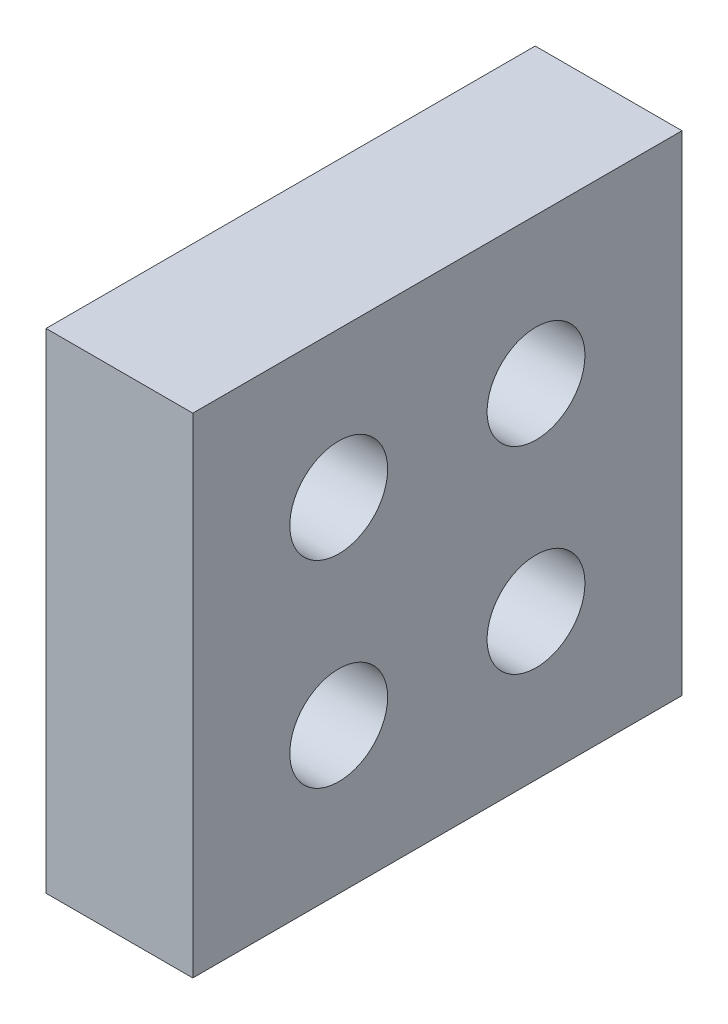
ISO-10303-21;
HEADER;
FILE_DESCRIPTION(('STEP AP214'),'2;1');
FILE_NAME('part.step','',(''),(''),'','','');
FILE_SCHEMA(('AUTOMOTIVE_DESIGN { 1 0 10303 214 1 1 1 1 }'));
ENDSEC;
DATA;
#1=APPLICATION_CONTEXT('core data for automotive mechanical design processes');
#2=APPLICATION_PROTOCOL_DEFINITION('international standard','automotive_design',2000,#1);
#3=PRODUCT_CONTEXT('',#1,'mechanical');
#4=PRODUCT('Part','Part','',(#3));
#5=PRODUCT_RELATED_PRODUCT_CATEGORY('part','',(#4));
#6=PRODUCT_DEFINITION_FORMATION('','',#4);
#7=PRODUCT_DEFINITION_CONTEXT('part definition',#1,'design');
#8=PRODUCT_DEFINITION('design','',#6,#7);
#9=PRODUCT_DEFINITION_SHAPE('','',#8);
#10=(LENGTH_UNIT() NAMED_UNIT(*) SI_UNIT(.MILLI.,.METRE.));
#11=(NAMED_UNIT(*) PLANE_ANGLE_UNIT() SI_UNIT($,.RADIAN.));
#12=(NAMED_UNIT(*) SI_UNIT($,.STERADIAN.) SOLID_ANGLE_UNIT());
#13=UNCERTAINTY_MEASURE_WITH_UNIT(LENGTH_MEASURE(1.E-05),#10,'distance_accuracy_value','');
#14=(GEOMETRIC_REPRESENTATION_CONTEXT(3) GLOBAL_UNCERTAINTY_ASSIGNED_CONTEXT((#13)) GLOBAL_UNIT_ASSIGNED_CONTEXT((#10,
#11,#12)) REPRESENTATION_CONTEXT('',''));
#15=CARTESIAN_POINT('',(0.,0.,0.));
#16=DIRECTION('',(0.,0.,1.));
#17=DIRECTION('',(1.,0.,0.));
#18=AXIS2_PLACEMENT_3D('',#15,#16,#17);
#19=CARTESIAN_POINT('',(9.,-15.,0.));
#20=DIRECTION('',(0.,-1.,0.));
#21=DIRECTION('',(0.,0.,-1.));
#22=AXIS2_PLACEMENT_3D('',#19,#20,#21);
#23=PLANE('',#22);
#24=DIRECTION('',(0.,0.,1.));
#25=VECTOR('',#24,1.);
#26=CARTESIAN_POINT('',(0.,-15.,0.));
#27=LINE('',#26,#25);
#28=CARTESIAN_POINT('',(0.,-15.,-15.));
#29=VERTEX_POINT('',#28);
#30=CARTESIAN_POINT('',(0.,-15.,15.));
#31=VERTEX_POINT('',#30);
#32=EDGE_CURVE('E117',#29,#31,#27,.T.);
#33=ORIENTED_EDGE('',*,*,#32,.F.);
#34=DIRECTION('',(-1.,0.,0.));
#35=VECTOR('',#34,1.);
#36=CARTESIAN_POINT('',(9.,-15.,-15.));
#37=LINE('',#36,#35);
#38=CARTESIAN_POINT('',(9.,-15.,-15.));
#39=VERTEX_POINT('',#38);
#40=EDGE_CURVE('E11',#39,#29,#37,.T.);
#41=ORIENTED_EDGE('',*,*,#40,.F.);
#42=DIRECTION('',(0.,0.,1.));
#43=VECTOR('',#42,1.);
#44=CARTESIAN_POINT('',(9.,-15.,0.));
#45=LINE('',#44,#43);
#46=CARTESIAN_POINT('',(9.,-15.,15.));
#47=VERTEX_POINT('',#46);
#48=EDGE_CURVE('E90',#39,#47,#45,.T.);
#49=ORIENTED_EDGE('',*,*,#48,.T.);
#50=DIRECTION('',(-1.,0.,0.));
#51=VECTOR('',#50,1.);
#52=CARTESIAN_POINT('',(9.,-15.,15.));
#53=LINE('',#52,#51);
#54=EDGE_CURVE('E57',#47,#31,#53,.T.);
#55=ORIENTED_EDGE('',*,*,#54,.T.);
#56=EDGE_LOOP('',(#33,#41,#49,#55));
#57=FACE_BOUND('',#56,.T.);
#58=ADVANCED_FACE('F41',(#57),#23,.T.);
#59=CARTESIAN_POINT('',(9.,0.,-15.));
#60=DIRECTION('',(0.,0.,1.));
#61=DIRECTION('',(1.,0.,0.));
#62=AXIS2_PLACEMENT_3D('',#59,#60,#61);
#63=PLANE('',#62);
#64=DIRECTION('',(0.,1.,0.));
#65=VECTOR('',#64,1.);
#66=CARTESIAN_POINT('',(0.,0.,-15.));
#67=LINE('',#66,#65);
#68=CARTESIAN_POINT('',(0.,15.,-15.));
#69=VERTEX_POINT('',#68);
#70=EDGE_CURVE('E96',#29,#69,#67,.T.);
#71=ORIENTED_EDGE('',*,*,#70,.T.);
#72=DIRECTION('',(-1.,0.,0.));
#73=VECTOR('',#72,1.);
#74=CARTESIAN_POINT('',(9.,15.,-15.));
#75=LINE('',#74,#73);
#76=CARTESIAN_POINT('',(9.,15.,-15.));
#77=VERTEX_POINT('',#76);
#78=EDGE_CURVE('E49',#77,#69,#75,.T.);
#79=ORIENTED_EDGE('',*,*,#78,.F.);
#80=DIRECTION('',(0.,1.,0.));
#81=VECTOR('',#80,1.);
#82=CARTESIAN_POINT('',(9.,0.,-15.));
#83=LINE('',#82,#81);
#84=EDGE_CURVE('E83',#39,#77,#83,.T.);
#85=ORIENTED_EDGE('',*,*,#84,.F.);
#86=ORIENTED_EDGE('',*,*,#40,.T.);
#87=EDGE_LOOP('',(#71,#79,#85,#86));
#88=FACE_BOUND('',#87,.T.);
#89=ADVANCED_FACE('F94',(#88),#63,.F.);
#90=CARTESIAN_POINT('',(9.,15.,0.));
#91=DIRECTION('',(0.,-1.,0.));
#92=DIRECTION('',(0.,0.,-1.));
#93=AXIS2_PLACEMENT_3D('',#90,#91,#92);
#94=PLANE('',#93);
#95=DIRECTION('',(0.,0.,1.));
#96=VECTOR('',#95,1.);
#97=CARTESIAN_POINT('',(0.,15.,0.));
#98=LINE('',#97,#96);
#99=CARTESIAN_POINT('',(0.,15.,15.));
#100=VERTEX_POINT('',#99);
#101=EDGE_CURVE('E120',#69,#100,#98,.T.);
#102=ORIENTED_EDGE('',*,*,#101,.T.);
#103=DIRECTION('',(-1.,0.,0.));
#104=VECTOR('',#103,1.);
#105=CARTESIAN_POINT('',(9.,15.,15.));
#106=LINE('',#105,#104);
#107=CARTESIAN_POINT('',(9.,15.,15.));
#108=VERTEX_POINT('',#107);
#109=EDGE_CURVE('E71',#108,#100,#106,.T.);
#110=ORIENTED_EDGE('',*,*,#109,.F.);
#111=DIRECTION('',(0.,0.,1.));
#112=VECTOR('',#111,1.);
#113=CARTESIAN_POINT('',(9.,15.,0.));
#114=LINE('',#113,#112);
#115=EDGE_CURVE('E89',#77,#108,#114,.T.);
#116=ORIENTED_EDGE('',*,*,#115,.F.);
#117=ORIENTED_EDGE('',*,*,#78,.T.);
#118=EDGE_LOOP('',(#102,#110,#116,#117));
#119=FACE_BOUND('',#118,.T.);
#120=ADVANCED_FACE('F99',(#119),#94,.F.);
#121=CARTESIAN_POINT('',(9.,-6.05025253169417,-6.05025253169417));
#122=DIRECTION('',(-1.,0.,0.));
#123=DIRECTION('',(0.,0.,1.));
#124=AXIS2_PLACEMENT_3D('',#121,#122,#123);
#125=CYLINDRICAL_SURFACE('',#124,3.);
#126=CARTESIAN_POINT('',(9.,-6.05025253169417,-6.05025253169417));
#127=DIRECTION('',(1.,0.,0.));
#128=DIRECTION('',(0.,0.,-1.));
#129=AXIS2_PLACEMENT_3D('',#126,#127,#128);
#130=CIRCLE('',#129,3.);
#131=CARTESIAN_POINT('',(9.,-6.05025253169417,-9.05025253169416));
#132=VERTEX_POINT('',#131);
#133=EDGE_CURVE('E111',#132,#132,#130,.T.);
#134=ORIENTED_EDGE('',*,*,#133,.T.);
#135=EDGE_LOOP('',(#134));
#136=FACE_BOUND('',#135,.T.);
#137=CARTESIAN_POINT('',(0.,-6.05025253169417,-6.05025253169417));
#138=DIRECTION('',(1.,0.,0.));
#139=DIRECTION('',(0.,0.,-1.));
#140=AXIS2_PLACEMENT_3D('',#137,#138,#139);
#141=CIRCLE('',#140,3.);
#142=CARTESIAN_POINT('',(0.,-6.05025253169417,-9.05025253169416));
#143=VERTEX_POINT('',#142);
#144=EDGE_CURVE('E131',#143,#143,#141,.T.);
#145=ORIENTED_EDGE('',*,*,#144,.F.);
#146=EDGE_LOOP('',(#145));
#147=FACE_BOUND('',#146,.T.);
#148=ADVANCED_FACE('F162',(#136,#147),#125,.F.);
#149=CARTESIAN_POINT('',(9.,6.05025253169417,6.05025253169416));
#150=DIRECTION('',(-1.,0.,0.));
#151=DIRECTION('',(0.,0.,1.));
#152=AXIS2_PLACEMENT_3D('',#149,#150,#151);
#153=CYLINDRICAL_SURFACE('',#152,3.);
#154=CARTESIAN_POINT('',(9.,6.05025253169417,6.05025253169416));
#155=DIRECTION('',(1.,0.,0.));
#156=DIRECTION('',(0.,0.,-1.));
#157=AXIS2_PLACEMENT_3D('',#154,#155,#156);
#158=CIRCLE('',#157,3.);
#159=CARTESIAN_POINT('',(9.,6.05025253169417,3.05025253169416));
#160=VERTEX_POINT('',#159);
#161=EDGE_CURVE('E108',#160,#160,#158,.T.);
#162=ORIENTED_EDGE('',*,*,#161,.T.);
#163=EDGE_LOOP('',(#162));
#164=FACE_BOUND('',#163,.T.);
#165=CARTESIAN_POINT('',(0.,6.05025253169417,6.05025253169416));
#166=DIRECTION('',(1.,0.,0.));
#167=DIRECTION('',(0.,0.,-1.));
#168=AXIS2_PLACEMENT_3D('',#165,#166,#167);
#169=CIRCLE('',#168,3.);
#170=CARTESIAN_POINT('',(0.,6.05025253169417,3.05025253169416));
#171=VERTEX_POINT('',#170);
#172=EDGE_CURVE('E128',#171,#171,#169,.T.);
#173=ORIENTED_EDGE('',*,*,#172,.F.);
#174=EDGE_LOOP('',(#173));
#175=FACE_BOUND('',#174,.T.);
#176=ADVANCED_FACE('F151',(#164,#175),#153,.F.);
#177=CARTESIAN_POINT('',(9.,-6.05025253169417,6.05025253169416));
#178=DIRECTION('',(-1.,0.,0.));
#179=DIRECTION('',(0.,0.,1.));
#180=AXIS2_PLACEMENT_3D('',#177,#178,#179);
#181=CYLINDRICAL_SURFACE('',#180,3.);
#182=CARTESIAN_POINT('',(9.,-6.05025253169417,6.05025253169416));
#183=DIRECTION('',(1.,0.,0.));
#184=DIRECTION('',(0.,0.,-1.));
#185=AXIS2_PLACEMENT_3D('',#182,#183,#184);
#186=CIRCLE('',#185,3.);
#187=CARTESIAN_POINT('',(9.,-6.05025253169417,3.05025253169416));
#188=VERTEX_POINT('',#187);
#189=EDGE_CURVE('E102',#188,#188,#186,.F.);
#190=ORIENTED_EDGE('',*,*,#189,.F.);
#191=EDGE_LOOP('',(#190));
#192=FACE_BOUND('',#191,.T.);
#193=CARTESIAN_POINT('',(0.,-6.05025253169417,6.05025253169416));
#194=DIRECTION('',(1.,0.,0.));
#195=DIRECTION('',(0.,0.,-1.));
#196=AXIS2_PLACEMENT_3D('',#193,#194,#195);
#197=CIRCLE('',#196,3.);
#198=CARTESIAN_POINT('',(0.,-6.05025253169417,3.05025253169416));
#199=VERTEX_POINT('',#198);
#200=EDGE_CURVE('E125',#199,#199,#197,.F.);
#201=ORIENTED_EDGE('',*,*,#200,.T.);
#202=EDGE_LOOP('',(#201));
#203=FACE_BOUND('',#202,.T.);
#204=ADVANCED_FACE('F143',(#192,#203),#181,.F.);
#205=CARTESIAN_POINT('',(9.,0.,15.));
#206=DIRECTION('',(0.,0.,1.));
#207=DIRECTION('',(0.,-1.,0.));
#208=AXIS2_PLACEMENT_3D('',#205,#206,#207);
#209=PLANE('',#208);
#210=DIRECTION('',(0.,1.,0.));
#211=VECTOR('',#210,1.);
#212=CARTESIAN_POINT('',(0.,0.,15.));
#213=LINE('',#212,#211);
#214=EDGE_CURVE('E122',#31,#100,#213,.T.);
#215=ORIENTED_EDGE('',*,*,#214,.F.);
#216=ORIENTED_EDGE('',*,*,#54,.F.);
#217=DIRECTION('',(0.,1.,0.));
#218=VECTOR('',#217,1.);
#219=CARTESIAN_POINT('',(9.,0.,15.));
#220=LINE('',#219,#218);
#221=EDGE_CURVE('E100',#47,#108,#220,.T.);
#222=ORIENTED_EDGE('',*,*,#221,.T.);
#223=ORIENTED_EDGE('',*,*,#109,.T.);
#224=EDGE_LOOP('',(#215,#216,#222,#223));
#225=FACE_BOUND('',#224,.T.);
#226=ADVANCED_FACE('F140',(#225),#209,.T.);
#227=CARTESIAN_POINT('',(9.,6.05025253169417,-6.05025253169416));
#228=DIRECTION('',(-1.,0.,0.));
#229=DIRECTION('',(0.,0.,1.));
#230=AXIS2_PLACEMENT_3D('',#227,#228,#229);
#231=CYLINDRICAL_SURFACE('',#230,3.);
#232=CARTESIAN_POINT('',(9.,6.05025253169417,-6.05025253169416));
#233=DIRECTION('',(1.,0.,0.));
#234=DIRECTION('',(0.,0.,-1.));
#235=AXIS2_PLACEMENT_3D('',#232,#233,#234);
#236=CIRCLE('',#235,3.);
#237=CARTESIAN_POINT('',(9.,6.05025253169417,-9.05025253169416));
#238=VERTEX_POINT('',#237);
#239=EDGE_CURVE('E114',#238,#238,#236,.F.);
#240=ORIENTED_EDGE('',*,*,#239,.F.);
#241=EDGE_LOOP('',(#240));
#242=FACE_BOUND('',#241,.T.);
#243=CARTESIAN_POINT('',(0.,6.05025253169417,-6.05025253169416));
#244=DIRECTION('',(1.,0.,0.));
#245=DIRECTION('',(0.,0.,-1.));
#246=AXIS2_PLACEMENT_3D('',#243,#244,#245);
#247=CIRCLE('',#246,3.);
#248=CARTESIAN_POINT('',(0.,6.05025253169417,-9.05025253169416));
#249=VERTEX_POINT('',#248);
#250=EDGE_CURVE('E134',#249,#249,#247,.F.);
#251=ORIENTED_EDGE('',*,*,#250,.T.);
#252=EDGE_LOOP('',(#251));
#253=FACE_BOUND('',#252,.T.);
#254=ADVANCED_FACE('F142',(#242,#253),#231,.F.);
#255=CARTESIAN_POINT('',(9.,0.,0.));
#256=DIRECTION('',(1.,0.,0.));
#257=DIRECTION('',(0.,0.,-1.));
#258=AXIS2_PLACEMENT_3D('',#255,#256,#257);
#259=PLANE('',#258);
#260=ORIENTED_EDGE('',*,*,#48,.F.);
#261=ORIENTED_EDGE('',*,*,#84,.T.);
#262=ORIENTED_EDGE('',*,*,#115,.T.);
#263=ORIENTED_EDGE('',*,*,#221,.F.);
#264=EDGE_LOOP('',(#260,#261,#262,#263));
#265=FACE_BOUND('',#264,.T.);
#266=ORIENTED_EDGE('',*,*,#189,.T.);
#267=EDGE_LOOP('',(#266));
#268=FACE_BOUND('',#267,.T.);
#269=ORIENTED_EDGE('',*,*,#161,.F.);
#270=EDGE_LOOP('',(#269));
#271=FACE_BOUND('',#270,.T.);
#272=ORIENTED_EDGE('',*,*,#133,.F.);
#273=EDGE_LOOP('',(#272));
#274=FACE_BOUND('',#273,.T.);
#275=ORIENTED_EDGE('',*,*,#239,.T.);
#276=EDGE_LOOP('',(#275));
#277=FACE_BOUND('',#276,.T.);
#278=ADVANCED_FACE('F85',(#265,#268,#271,#274,#277),#259,.T.);
#279=CARTESIAN_POINT('',(0.,0.,0.));
#280=DIRECTION('',(1.,0.,0.));
#281=DIRECTION('',(0.,0.,-1.));
#282=AXIS2_PLACEMENT_3D('',#279,#280,#281);
#283=PLANE('',#282);
#284=ORIENTED_EDGE('',*,*,#32,.T.);
#285=ORIENTED_EDGE('',*,*,#214,.T.);
#286=ORIENTED_EDGE('',*,*,#101,.F.);
#287=ORIENTED_EDGE('',*,*,#70,.F.);
#288=EDGE_LOOP('',(#284,#285,#286,#287));
#289=FACE_BOUND('',#288,.T.);
#290=ORIENTED_EDGE('',*,*,#200,.F.);
#291=EDGE_LOOP('',(#290));
#292=FACE_BOUND('',#291,.T.);
#293=ORIENTED_EDGE('',*,*,#172,.T.);
#294=EDGE_LOOP('',(#293));
#295=FACE_BOUND('',#294,.T.);
#296=ORIENTED_EDGE('',*,*,#144,.T.);
#297=EDGE_LOOP('',(#296));
#298=FACE_BOUND('',#297,.T.);
#299=ORIENTED_EDGE('',*,*,#250,.F.);
#300=EDGE_LOOP('',(#299));
#301=FACE_BOUND('',#300,.T.);
#302=ADVANCED_FACE('F175',(#289,#292,#295,#298,#301),#283,.F.);
#303=CLOSED_SHELL('',(#58,#89,#120,#148,#176,#204,#226,#254,#278,#302));
#304=MANIFOLD_SOLID_BREP('B2',#303);
#305=ADVANCED_BREP_SHAPE_REPRESENTATION('',(#18,#304),#14);
#306=SHAPE_DEFINITION_REPRESENTATION(#9,#305);
ENDSEC;
END-ISO-10303-21;
